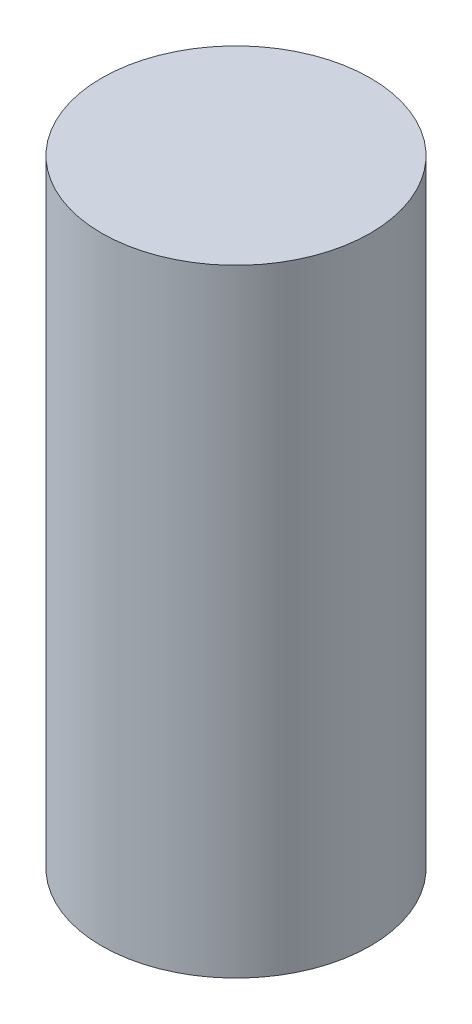
ISO-10303-21;
HEADER;
FILE_DESCRIPTION(('STEP AP214'),'2;1');
FILE_NAME('part.step','',(''),(''),'','','');
FILE_SCHEMA(('AUTOMOTIVE_DESIGN { 1 0 10303 214 1 1 1 1 }'));
ENDSEC;
DATA;
#1=APPLICATION_CONTEXT('core data for automotive mechanical design processes');
#2=APPLICATION_PROTOCOL_DEFINITION('international standard','automotive_design',2000,#1);
#3=PRODUCT_CONTEXT('',#1,'mechanical');
#4=PRODUCT('Part','Part','',(#3));
#5=PRODUCT_RELATED_PRODUCT_CATEGORY('part','',(#4));
#6=PRODUCT_DEFINITION_FORMATION('','',#4);
#7=PRODUCT_DEFINITION_CONTEXT('part definition',#1,'design');
#8=PRODUCT_DEFINITION('design','',#6,#7);
#9=PRODUCT_DEFINITION_SHAPE('','',#8);
#10=(LENGTH_UNIT() NAMED_UNIT(*) SI_UNIT(.MILLI.,.METRE.));
#11=(NAMED_UNIT(*) PLANE_ANGLE_UNIT() SI_UNIT($,.RADIAN.));
#12=(NAMED_UNIT(*) SI_UNIT($,.STERADIAN.) SOLID_ANGLE_UNIT());
#13=UNCERTAINTY_MEASURE_WITH_UNIT(LENGTH_MEASURE(1.E-05),#10,'distance_accuracy_value','');
#14=(GEOMETRIC_REPRESENTATION_CONTEXT(3) GLOBAL_UNCERTAINTY_ASSIGNED_CONTEXT((#13)) GLOBAL_UNIT_ASSIGNED_CONTEXT((#10,
#11,#12)) REPRESENTATION_CONTEXT('',''));
#15=CARTESIAN_POINT('',(0.,0.,0.));
#16=DIRECTION('',(0.,0.,1.));
#17=DIRECTION('',(1.,0.,0.));
#18=AXIS2_PLACEMENT_3D('',#15,#16,#17);
#19=CARTESIAN_POINT('',(0.,56.5,0.));
#20=DIRECTION('',(0.,-1.,0.));
#21=DIRECTION('',(0.,0.,-1.));
#22=AXIS2_PLACEMENT_3D('',#19,#20,#21);
#23=CYLINDRICAL_SURFACE('',#22,12.3);
#24=CARTESIAN_POINT('',(0.,56.5,0.));
#25=DIRECTION('',(0.,1.,0.));
#26=DIRECTION('',(0.,0.,1.));
#27=AXIS2_PLACEMENT_3D('',#24,#25,#26);
#28=CIRCLE('',#27,12.3);
#29=CARTESIAN_POINT('',(0.,56.5,12.3));
#30=VERTEX_POINT('',#29);
#31=EDGE_CURVE('E10',#30,#30,#28,.T.);
#32=ORIENTED_EDGE('',*,*,#31,.F.);
#33=EDGE_LOOP('',(#32));
#34=FACE_BOUND('',#33,.T.);
#35=CARTESIAN_POINT('',(0.,0.,0.));
#36=DIRECTION('',(0.,1.,0.));
#37=DIRECTION('',(0.,0.,1.));
#38=AXIS2_PLACEMENT_3D('',#35,#36,#37);
#39=CIRCLE('',#38,12.3);
#40=CARTESIAN_POINT('',(0.,0.,12.3));
#41=VERTEX_POINT('',#40);
#42=EDGE_CURVE('E44',#41,#41,#39,.T.);
#43=ORIENTED_EDGE('',*,*,#42,.T.);
#44=EDGE_LOOP('',(#43));
#45=FACE_BOUND('',#44,.T.);
#46=ADVANCED_FACE('F41',(#34,#45),#23,.T.);
#47=CARTESIAN_POINT('',(0.,56.5,0.));
#48=DIRECTION('',(0.,1.,0.));
#49=DIRECTION('',(0.,0.,1.));
#50=AXIS2_PLACEMENT_3D('',#47,#48,#49);
#51=PLANE('',#50);
#52=ORIENTED_EDGE('',*,*,#31,.T.);
#53=EDGE_LOOP('',(#52));
#54=FACE_BOUND('',#53,.T.);
#55=ADVANCED_FACE('F74',(#54),#51,.T.);
#56=CARTESIAN_POINT('',(0.,0.,0.));
#57=DIRECTION('',(0.,1.,0.));
#58=DIRECTION('',(0.,0.,1.));
#59=AXIS2_PLACEMENT_3D('',#56,#57,#58);
#60=PLANE('',#59);
#61=CARTESIAN_POINT('',(0.,0.,0.));
#62=DIRECTION('',(0.,-1.,0.));
#63=DIRECTION('',(0.,0.,-1.));
#64=AXIS2_PLACEMENT_3D('',#61,#62,#63);
#65=CIRCLE('',#64,10.);
#66=CARTESIAN_POINT('',(0.,0.,-10.));
#67=VERTEX_POINT('',#66);
#68=EDGE_CURVE('E55',#67,#67,#65,.T.);
#69=ORIENTED_EDGE('',*,*,#68,.F.);
#70=EDGE_LOOP('',(#69));
#71=FACE_BOUND('',#70,.T.);
#72=ORIENTED_EDGE('',*,*,#42,.F.);
#73=EDGE_LOOP('',(#72));
#74=FACE_BOUND('',#73,.T.);
#75=ADVANCED_FACE('F68',(#71,#74),#60,.F.);
#76=CARTESIAN_POINT('',(0.,6.5,0.));
#77=DIRECTION('',(0.,-1.,0.));
#78=DIRECTION('',(0.,0.,-1.));
#79=AXIS2_PLACEMENT_3D('',#76,#77,#78);
#80=CYLINDRICAL_SURFACE('',#79,10.);
#81=CARTESIAN_POINT('',(0.,6.5,0.));
#82=DIRECTION('',(0.,-1.,0.));
#83=DIRECTION('',(0.,0.,-1.));
#84=AXIS2_PLACEMENT_3D('',#81,#82,#83);
#85=CIRCLE('',#84,10.);
#86=CARTESIAN_POINT('',(0.,6.5,-10.));
#87=VERTEX_POINT('',#86);
#88=EDGE_CURVE('E53',#87,#87,#85,.T.);
#89=CARTESIAN_POINT('',(0.,6.5,-10.));
#90=CARTESIAN_POINT('',(0.,6.43229166666667,-10.));
#91=CARTESIAN_POINT('',(0.,6.36458333333333,-10.));
#92=CARTESIAN_POINT('',(0.,6.22916666666667,-10.));
#93=CARTESIAN_POINT('',(0.,6.16145833333333,-10.));
#94=CARTESIAN_POINT('',(0.,6.02604166666667,-10.));
#95=CARTESIAN_POINT('',(0.,5.95833333333333,-10.));
#96=CARTESIAN_POINT('',(0.,5.82291666666667,-10.));
#97=CARTESIAN_POINT('',(0.,5.75520833333333,-10.));
#98=CARTESIAN_POINT('',(0.,5.61979166666667,-10.));
#99=CARTESIAN_POINT('',(0.,5.55208333333333,-10.));
#100=CARTESIAN_POINT('',(0.,5.41666666666667,-10.));
#101=CARTESIAN_POINT('',(0.,5.34895833333333,-10.));
#102=CARTESIAN_POINT('',(0.,5.21354166666667,-10.));
#103=CARTESIAN_POINT('',(0.,5.14583333333333,-10.));
#104=CARTESIAN_POINT('',(0.,5.01041666666667,-10.));
#105=CARTESIAN_POINT('',(0.,4.94270833333333,-10.));
#106=CARTESIAN_POINT('',(0.,4.80729166666667,-10.));
#107=CARTESIAN_POINT('',(0.,4.73958333333333,-10.));
#108=CARTESIAN_POINT('',(0.,4.60416666666667,-10.));
#109=CARTESIAN_POINT('',(0.,4.53645833333333,-10.));
#110=CARTESIAN_POINT('',(0.,4.40104166666667,-10.));
#111=CARTESIAN_POINT('',(0.,4.33333333333333,-10.));
#112=CARTESIAN_POINT('',(0.,4.19791666666667,-10.));
#113=CARTESIAN_POINT('',(0.,4.13020833333333,-10.));
#114=CARTESIAN_POINT('',(0.,3.99479166666667,-10.));
#115=CARTESIAN_POINT('',(0.,3.92708333333333,-10.));
#116=CARTESIAN_POINT('',(0.,3.79166666666667,-10.));
#117=CARTESIAN_POINT('',(0.,3.72395833333333,-10.));
#118=CARTESIAN_POINT('',(0.,3.58854166666667,-10.));
#119=CARTESIAN_POINT('',(0.,3.52083333333333,-10.));
#120=CARTESIAN_POINT('',(0.,3.38541666666667,-10.));
#121=CARTESIAN_POINT('',(0.,3.31770833333333,-10.));
#122=CARTESIAN_POINT('',(0.,3.18229166666667,-10.));
#123=CARTESIAN_POINT('',(0.,3.11458333333333,-10.));
#124=CARTESIAN_POINT('',(0.,2.97916666666667,-10.));
#125=CARTESIAN_POINT('',(0.,2.91145833333333,-10.));
#126=CARTESIAN_POINT('',(0.,2.77604166666667,-10.));
#127=CARTESIAN_POINT('',(0.,2.70833333333333,-10.));
#128=CARTESIAN_POINT('',(0.,2.57291666666667,-10.));
#129=CARTESIAN_POINT('',(0.,2.50520833333333,-10.));
#130=CARTESIAN_POINT('',(0.,2.36979166666667,-10.));
#131=CARTESIAN_POINT('',(0.,2.30208333333333,-10.));
#132=CARTESIAN_POINT('',(0.,2.16666666666667,-10.));
#133=CARTESIAN_POINT('',(0.,2.09895833333333,-10.));
#134=CARTESIAN_POINT('',(0.,1.96354166666667,-10.));
#135=CARTESIAN_POINT('',(0.,1.89583333333333,-10.));
#136=CARTESIAN_POINT('',(0.,1.76041666666667,-10.));
#137=CARTESIAN_POINT('',(0.,1.69270833333333,-10.));
#138=CARTESIAN_POINT('',(0.,1.55729166666667,-10.));
#139=CARTESIAN_POINT('',(0.,1.48958333333333,-10.));
#140=CARTESIAN_POINT('',(0.,1.35416666666667,-10.));
#141=CARTESIAN_POINT('',(0.,1.28645833333333,-10.));
#142=CARTESIAN_POINT('',(0.,1.15104166666667,-10.));
#143=CARTESIAN_POINT('',(0.,1.08333333333333,-10.));
#144=CARTESIAN_POINT('',(0.,0.947916666666667,-10.));
#145=CARTESIAN_POINT('',(0.,0.880208333333333,-10.));
#146=CARTESIAN_POINT('',(0.,0.744791666666667,-10.));
#147=CARTESIAN_POINT('',(0.,0.677083333333334,-10.));
#148=CARTESIAN_POINT('',(0.,0.541666666666667,-10.));
#149=CARTESIAN_POINT('',(0.,0.473958333333334,-10.));
#150=CARTESIAN_POINT('',(0.,0.338541666666667,-10.));
#151=CARTESIAN_POINT('',(0.,0.270833333333334,-10.));
#152=CARTESIAN_POINT('',(0.,0.135416666666667,-10.));
#153=CARTESIAN_POINT('',(0.,0.0677083333333333,-10.));
#154=CARTESIAN_POINT('',(0.,0.,-10.));
#155=B_SPLINE_CURVE_WITH_KNOTS('',3,(#89,#90,#91,#92,#93,#94,#95,#96,#97,#98,#99,#100,#101,#102,
#103,#104,#105,#106,#107,#108,#109,#110,#111,#112,#113,#114,#115,#116,#117,#118,#119,#120,#121,
#122,#123,#124,#125,#126,#127,#128,#129,#130,#131,#132,#133,#134,#135,#136,#137,#138,#139,#140,
#141,#142,#143,#144,#145,#146,#147,#148,#149,#150,#151,#152,#153,#154),.UNSPECIFIED.,.F.,.F.,(4,
2,2,2,2,2,2,2,2,2,2,2,2,2,2,2,2,2,2,2,2,2,2,2,2,2,2,2,2,2,2,2,4),(0.,0.203125,0.40625,
0.609375000000001,0.812500000000001,1.015625,1.21875,1.421875,1.625,1.828125,2.03125,2.234375,
2.4375,2.640625,2.84375,3.046875,3.25,3.453125,3.65625,3.859375,4.0625,4.265625,4.46875,
4.671875,4.875,5.078125,5.28125,5.484375,5.6875,5.890625,6.09375,6.296875,6.5),.UNSPECIFIED.);
#156=EDGE_CURVE('BSEAM65',#87,#67,#155,.T.);
#157=ORIENTED_EDGE('',*,*,#88,.F.);
#158=ORIENTED_EDGE('',*,*,#68,.T.);
#159=ORIENTED_EDGE('',*,*,#156,.T.);
#160=ORIENTED_EDGE('',*,*,#156,.F.);
#161=EDGE_LOOP('',(#157,#159,#158,#160));
#162=FACE_BOUND('',#161,.T.);
#163=ADVANCED_FACE('F65',(#162),#80,.F.);
#164=CARTESIAN_POINT('',(0.,6.5,0.));
#165=DIRECTION('',(0.,-1.,0.));
#166=DIRECTION('',(0.,0.,-1.));
#167=AXIS2_PLACEMENT_3D('',#164,#165,#166);
#168=PLANE('',#167);
#169=ORIENTED_EDGE('',*,*,#88,.T.);
#170=EDGE_LOOP('',(#169));
#171=FACE_BOUND('',#170,.T.);
#172=ADVANCED_FACE('F63',(#171),#168,.T.);
#173=CLOSED_SHELL('',(#46,#55,#75,#163,#172));
#174=MANIFOLD_SOLID_BREP('B2',#173);
#175=ADVANCED_BREP_SHAPE_REPRESENTATION('',(#18,#174),#14);
#176=SHAPE_DEFINITION_REPRESENTATION(#9,#175);
ENDSEC;
END-ISO-10303-21;
